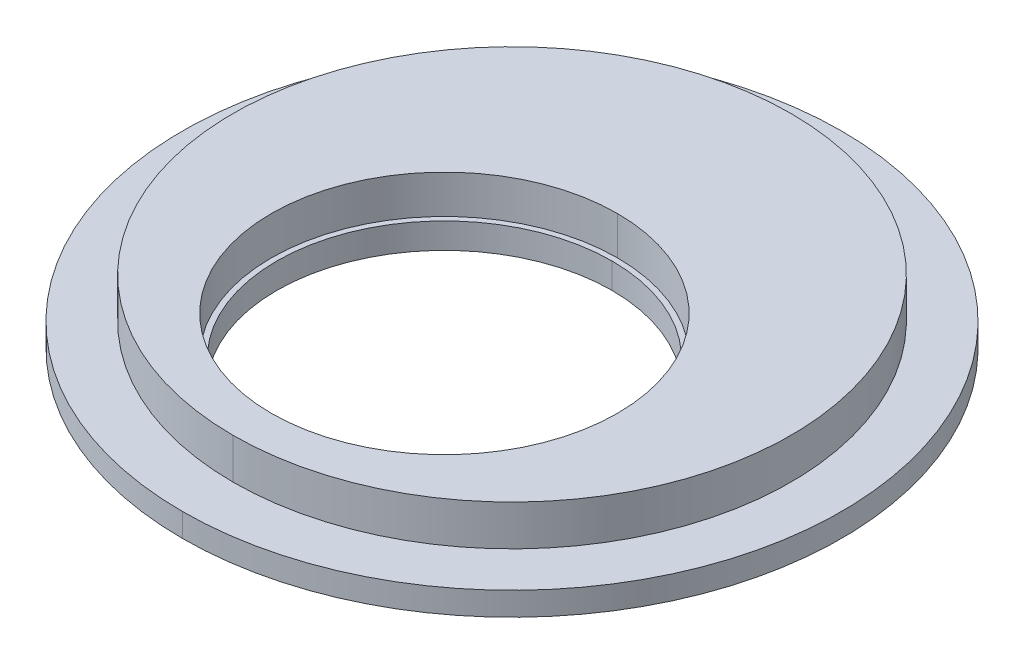
ISO-10303-21;
HEADER;
FILE_DESCRIPTION(('STEP AP214'),'2;1');
FILE_NAME('part.step','',(''),(''),'','','');
FILE_SCHEMA(('AUTOMOTIVE_DESIGN { 1 0 10303 214 1 1 1 1 }'));
ENDSEC;
DATA;
#1=APPLICATION_CONTEXT('core data for automotive mechanical design processes');
#2=APPLICATION_PROTOCOL_DEFINITION('international standard','automotive_design',2000,#1);
#3=PRODUCT_CONTEXT('',#1,'mechanical');
#4=PRODUCT('Part','Part','',(#3));
#5=PRODUCT_RELATED_PRODUCT_CATEGORY('part','',(#4));
#6=PRODUCT_DEFINITION_FORMATION('','',#4);
#7=PRODUCT_DEFINITION_CONTEXT('part definition',#1,'design');
#8=PRODUCT_DEFINITION('design','',#6,#7);
#9=PRODUCT_DEFINITION_SHAPE('','',#8);
#10=(LENGTH_UNIT() NAMED_UNIT(*) SI_UNIT(.MILLI.,.METRE.));
#11=(NAMED_UNIT(*) PLANE_ANGLE_UNIT() SI_UNIT($,.RADIAN.));
#12=(NAMED_UNIT(*) SI_UNIT($,.STERADIAN.) SOLID_ANGLE_UNIT());
#13=UNCERTAINTY_MEASURE_WITH_UNIT(LENGTH_MEASURE(1.E-05),#10,'distance_accuracy_value','');
#14=(GEOMETRIC_REPRESENTATION_CONTEXT(3) GLOBAL_UNCERTAINTY_ASSIGNED_CONTEXT((#13)) GLOBAL_UNIT_ASSIGNED_CONTEXT((#10,
#11,#12)) REPRESENTATION_CONTEXT('',''));
#15=CARTESIAN_POINT('',(0.,0.,0.));
#16=DIRECTION('',(0.,0.,1.));
#17=DIRECTION('',(1.,0.,0.));
#18=AXIS2_PLACEMENT_3D('',#15,#16,#17);
#19=CARTESIAN_POINT('',(0.,4.591800062,12.7));
#20=DIRECTION('',(0.,-1.,0.));
#21=DIRECTION('',(0.,0.,-1.));
#22=AXIS2_PLACEMENT_3D('',#19,#20,#21);
#23=CYLINDRICAL_SURFACE('',#22,31.496);
#24=DIRECTION('',(0.,-1.,0.));
#25=VECTOR('',#24,1.);
#26=CARTESIAN_POINT('',(0.,4.591800062,44.196));
#27=LINE('',#26,#25);
#28=CARTESIAN_POINT('',(0.,4.591800062,44.196));
#29=VERTEX_POINT('',#28);
#30=CARTESIAN_POINT('',(0.,-0.2032,44.196));
#31=VERTEX_POINT('',#30);
#32=EDGE_CURVE('P0_E71',#29,#31,#27,.T.);
#33=ORIENTED_EDGE('',*,*,#32,.F.);
#34=CARTESIAN_POINT('',(0.,4.591800062,12.7));
#35=DIRECTION('',(0.,-1.,0.));
#36=DIRECTION('',(0.,0.,-1.));
#37=AXIS2_PLACEMENT_3D('',#34,#35,#36);
#38=CIRCLE('',#37,31.496);
#39=CARTESIAN_POINT('',(0.,4.591800062,-18.796));
#40=VERTEX_POINT('',#39);
#41=EDGE_CURVE('P0_E26',#40,#29,#38,.T.);
#42=ORIENTED_EDGE('',*,*,#41,.F.);
#43=DIRECTION('',(0.,-1.,0.));
#44=VECTOR('',#43,1.);
#45=CARTESIAN_POINT('',(0.,4.591800062,-18.796));
#46=LINE('',#45,#44);
#47=CARTESIAN_POINT('',(0.,-0.2032,-18.796));
#48=VERTEX_POINT('',#47);
#49=EDGE_CURVE('P0_E74',#40,#48,#46,.T.);
#50=ORIENTED_EDGE('',*,*,#49,.T.);
#51=CARTESIAN_POINT('',(0.,-0.2032,12.7));
#52=DIRECTION('',(0.,-1.,0.));
#53=DIRECTION('',(0.,0.,-1.));
#54=AXIS2_PLACEMENT_3D('',#51,#52,#53);
#55=CIRCLE('',#54,31.496);
#56=EDGE_CURVE('P0_E10',#48,#31,#55,.T.);
#57=ORIENTED_EDGE('',*,*,#56,.T.);
#58=EDGE_LOOP('',(#33,#42,#50,#57));
#59=FACE_BOUND('',#58,.T.);
#60=ADVANCED_FACE('P0_F16',(#59),#23,.F.);
#61=CARTESIAN_POINT('',(0.,-0.2032,12.7));
#62=DIRECTION('',(0.,-1.,0.));
#63=DIRECTION('',(0.,0.,-1.));
#64=AXIS2_PLACEMENT_3D('',#61,#62,#63);
#65=PLANE('',#64);
#66=ORIENTED_EDGE('',*,*,#56,.F.);
#67=CARTESIAN_POINT('',(0.,-0.2032,12.7));
#68=DIRECTION('',(0.,-1.,0.));
#69=DIRECTION('',(0.,0.,-1.));
#70=AXIS2_PLACEMENT_3D('',#67,#68,#69);
#71=CIRCLE('',#70,31.496);
#72=EDGE_CURVE('P0_E76',#31,#48,#71,.T.);
#73=ORIENTED_EDGE('',*,*,#72,.F.);
#74=EDGE_LOOP('',(#66,#73));
#75=FACE_BOUND('',#74,.T.);
#76=CARTESIAN_POINT('',(0.,-0.2032,12.7));
#77=DIRECTION('',(0.,-1.,0.));
#78=DIRECTION('',(0.,0.,-1.));
#79=AXIS2_PLACEMENT_3D('',#76,#77,#78);
#80=CIRCLE('',#79,32.512);
#81=CARTESIAN_POINT('',(0.,-0.2032,-19.812));
#82=VERTEX_POINT('',#81);
#83=CARTESIAN_POINT('',(0.,-0.2032,45.212));
#84=VERTEX_POINT('',#83);
#85=EDGE_CURVE('P0_E95',#82,#84,#80,.T.);
#86=ORIENTED_EDGE('',*,*,#85,.T.);
#87=CARTESIAN_POINT('',(0.,-0.2032,12.7));
#88=DIRECTION('',(0.,-1.,0.));
#89=DIRECTION('',(0.,0.,-1.));
#90=AXIS2_PLACEMENT_3D('',#87,#88,#89);
#91=CIRCLE('',#90,32.512);
#92=EDGE_CURVE('P0_E40',#84,#82,#91,.T.);
#93=ORIENTED_EDGE('',*,*,#92,.T.);
#94=EDGE_LOOP('',(#86,#93));
#95=FACE_BOUND('',#94,.T.);
#96=ADVANCED_FACE('P0_F77',(#75,#95),#65,.T.);
#97=CARTESIAN_POINT('',(0.,4.591800062,12.7));
#98=DIRECTION('',(0.,-1.,0.));
#99=DIRECTION('',(0.,0.,-1.));
#100=AXIS2_PLACEMENT_3D('',#97,#98,#99);
#101=PLANE('',#100);
#102=ORIENTED_EDGE('',*,*,#41,.T.);
#103=CARTESIAN_POINT('',(0.,4.591800062,12.7));
#104=DIRECTION('',(0.,-1.,0.));
#105=DIRECTION('',(0.,0.,-1.));
#106=AXIS2_PLACEMENT_3D('',#103,#104,#105);
#107=CIRCLE('',#106,31.496);
#108=EDGE_CURVE('P0_E83',#29,#40,#107,.T.);
#109=ORIENTED_EDGE('',*,*,#108,.T.);
#110=EDGE_LOOP('',(#102,#109));
#111=FACE_BOUND('',#110,.T.);
#112=CARTESIAN_POINT('',(0.,4.591800062,12.7));
#113=DIRECTION('',(0.,-1.,0.));
#114=DIRECTION('',(0.,0.,-1.));
#115=AXIS2_PLACEMENT_3D('',#112,#113,#114);
#116=CIRCLE('',#115,32.512);
#117=CARTESIAN_POINT('',(0.,4.591800062,-19.812));
#118=VERTEX_POINT('',#117);
#119=CARTESIAN_POINT('',(0.,4.591800062,45.212));
#120=VERTEX_POINT('',#119);
#121=EDGE_CURVE('P0_E92',#118,#120,#116,.T.);
#122=ORIENTED_EDGE('',*,*,#121,.F.);
#123=CARTESIAN_POINT('',(0.,4.591800062,12.7));
#124=DIRECTION('',(0.,-1.,0.));
#125=DIRECTION('',(0.,0.,-1.));
#126=AXIS2_PLACEMENT_3D('',#123,#124,#125);
#127=CIRCLE('',#126,32.512);
#128=EDGE_CURVE('P0_E19',#120,#118,#127,.T.);
#129=ORIENTED_EDGE('',*,*,#128,.F.);
#130=EDGE_LOOP('',(#122,#129));
#131=FACE_BOUND('',#130,.T.);
#132=ADVANCED_FACE('P0_F124',(#111,#131),#101,.F.);
#133=CARTESIAN_POINT('',(0.,4.591800062,12.7));
#134=DIRECTION('',(0.,-1.,0.));
#135=DIRECTION('',(0.,0.,-1.));
#136=AXIS2_PLACEMENT_3D('',#133,#134,#135);
#137=CYLINDRICAL_SURFACE('',#136,32.512);
#138=DIRECTION('',(0.,-1.,0.));
#139=VECTOR('',#138,1.);
#140=CARTESIAN_POINT('',(0.,4.591800062,45.212));
#141=LINE('',#140,#139);
#142=EDGE_CURVE('P0_E99',#120,#84,#141,.T.);
#143=ORIENTED_EDGE('',*,*,#142,.F.);
#144=ORIENTED_EDGE('',*,*,#128,.T.);
#145=DIRECTION('',(0.,-1.,0.));
#146=VECTOR('',#145,1.);
#147=CARTESIAN_POINT('',(0.,4.591800062,-19.812));
#148=LINE('',#147,#146);
#149=EDGE_CURVE('P0_E98',#118,#82,#148,.T.);
#150=ORIENTED_EDGE('',*,*,#149,.T.);
#151=ORIENTED_EDGE('',*,*,#92,.F.);
#152=EDGE_LOOP('',(#143,#144,#150,#151));
#153=FACE_BOUND('',#152,.T.);
#154=ADVANCED_FACE('P0_F118',(#153),#137,.T.);
#155=CARTESIAN_POINT('',(0.,4.591800062,12.7));
#156=DIRECTION('',(0.,-1.,0.));
#157=DIRECTION('',(0.,0.,-1.));
#158=AXIS2_PLACEMENT_3D('',#155,#156,#157);
#159=CYLINDRICAL_SURFACE('',#158,32.512);
#160=ORIENTED_EDGE('',*,*,#121,.T.);
#161=ORIENTED_EDGE('',*,*,#142,.T.);
#162=ORIENTED_EDGE('',*,*,#85,.F.);
#163=ORIENTED_EDGE('',*,*,#149,.F.);
#164=EDGE_LOOP('',(#160,#161,#162,#163));
#165=FACE_BOUND('',#164,.T.);
#166=ADVANCED_FACE('P0_F114',(#165),#159,.T.);
#167=CARTESIAN_POINT('',(0.,4.591800062,12.7));
#168=DIRECTION('',(0.,-1.,0.));
#169=DIRECTION('',(0.,0.,-1.));
#170=AXIS2_PLACEMENT_3D('',#167,#168,#169);
#171=CYLINDRICAL_SURFACE('',#170,31.496);
#172=ORIENTED_EDGE('',*,*,#108,.F.);
#173=ORIENTED_EDGE('',*,*,#32,.T.);
#174=ORIENTED_EDGE('',*,*,#72,.T.);
#175=ORIENTED_EDGE('',*,*,#49,.F.);
#176=EDGE_LOOP('',(#172,#173,#174,#175));
#177=FACE_BOUND('',#176,.T.);
#178=ADVANCED_FACE('P0_F81',(#177),#171,.F.);
#179=CLOSED_SHELL('',(#60,#96,#132,#154,#166,#178));
#180=MANIFOLD_SOLID_BREP('P0_B1',#179);
#181=CARTESIAN_POINT('',(0.,11.811,12.7));
#182=DIRECTION('',(0.,-1.,0.));
#183=DIRECTION('',(0.,0.,-1.));
#184=AXIS2_PLACEMENT_3D('',#181,#182,#183);
#185=CYLINDRICAL_SURFACE('',#184,32.512);
#186=DIRECTION('',(0.,-1.,0.));
#187=VECTOR('',#186,1.);
#188=CARTESIAN_POINT('',(0.,11.811,45.212));
#189=LINE('',#188,#187);
#190=CARTESIAN_POINT('',(0.,11.811,45.212));
#191=VERTEX_POINT('',#190);
#192=CARTESIAN_POINT('',(0.,-0.2032,45.212));
#193=VERTEX_POINT('',#192);
#194=EDGE_CURVE('P1_E133',#191,#193,#189,.T.);
#195=ORIENTED_EDGE('',*,*,#194,.F.);
#196=CARTESIAN_POINT('',(0.,11.811,12.7));
#197=DIRECTION('',(0.,-1.,0.));
#198=DIRECTION('',(0.,0.,-1.));
#199=AXIS2_PLACEMENT_3D('',#196,#197,#198);
#200=CIRCLE('',#199,32.512);
#201=CARTESIAN_POINT('',(0.,11.811,-19.812));
#202=VERTEX_POINT('',#201);
#203=EDGE_CURVE('P1_E11',#202,#191,#200,.T.);
#204=ORIENTED_EDGE('',*,*,#203,.F.);
#205=DIRECTION('',(0.,1.,0.));
#206=VECTOR('',#205,1.);
#207=CARTESIAN_POINT('',(0.,11.811,-19.812));
#208=LINE('',#207,#206);
#209=CARTESIAN_POINT('',(0.,-0.2032,-19.812));
#210=VERTEX_POINT('',#209);
#211=EDGE_CURVE('P1_E132',#210,#202,#208,.T.);
#212=ORIENTED_EDGE('',*,*,#211,.F.);
#213=CARTESIAN_POINT('',(0.,-0.2032,12.7));
#214=DIRECTION('',(0.,-1.,0.));
#215=DIRECTION('',(0.,0.,-1.));
#216=AXIS2_PLACEMENT_3D('',#213,#214,#215);
#217=CIRCLE('',#216,32.512);
#218=EDGE_CURVE('P1_E40',#210,#193,#217,.T.);
#219=ORIENTED_EDGE('',*,*,#218,.T.);
#220=EDGE_LOOP('',(#195,#204,#212,#219));
#221=FACE_BOUND('',#220,.T.);
#222=ADVANCED_FACE('P1_F17',(#221),#185,.F.);
#223=CARTESIAN_POINT('',(0.,11.811,0.));
#224=DIRECTION('',(0.,-1.,0.));
#225=DIRECTION('',(0.,0.,-1.));
#226=AXIS2_PLACEMENT_3D('',#223,#224,#225);
#227=CYLINDRICAL_SURFACE('',#226,52.3875);
#228=DIRECTION('',(0.,-1.,0.));
#229=VECTOR('',#228,1.);
#230=CARTESIAN_POINT('',(0.,11.811,52.3875));
#231=LINE('',#230,#229);
#232=CARTESIAN_POINT('',(0.,11.811,52.3875));
#233=VERTEX_POINT('',#232);
#234=CARTESIAN_POINT('',(0.,4.191,52.3875));
#235=VERTEX_POINT('',#234);
#236=EDGE_CURVE('P1_E88',#233,#235,#231,.T.);
#237=ORIENTED_EDGE('',*,*,#236,.F.);
#238=CARTESIAN_POINT('',(0.,11.811,0.));
#239=DIRECTION('',(0.,1.,0.));
#240=DIRECTION('',(0.,0.,1.));
#241=AXIS2_PLACEMENT_3D('',#238,#239,#240);
#242=CIRCLE('',#241,52.3875);
#243=CARTESIAN_POINT('',(0.,11.811,-52.3875));
#244=VERTEX_POINT('',#243);
#245=EDGE_CURVE('P1_E27',#244,#233,#242,.T.);
#246=ORIENTED_EDGE('',*,*,#245,.F.);
#247=DIRECTION('',(0.,-1.,0.));
#248=VECTOR('',#247,1.);
#249=CARTESIAN_POINT('',(0.,11.811,-52.3875));
#250=LINE('',#249,#248);
#251=CARTESIAN_POINT('',(0.,4.191,-52.3875));
#252=VERTEX_POINT('',#251);
#253=EDGE_CURVE('P1_E91',#244,#252,#250,.T.);
#254=ORIENTED_EDGE('',*,*,#253,.T.);
#255=CARTESIAN_POINT('',(0.,4.191,0.));
#256=DIRECTION('',(0.,1.,0.));
#257=DIRECTION('',(0.,0.,1.));
#258=AXIS2_PLACEMENT_3D('',#255,#256,#257);
#259=CIRCLE('',#258,52.3875);
#260=EDGE_CURVE('P1_E21',#252,#235,#259,.T.);
#261=ORIENTED_EDGE('',*,*,#260,.T.);
#262=EDGE_LOOP('',(#237,#246,#254,#261));
#263=FACE_BOUND('',#262,.T.);
#264=ADVANCED_FACE('P1_F86',(#263),#227,.T.);
#265=CARTESIAN_POINT('',(0.,11.811,0.));
#266=DIRECTION('',(0.,1.,0.));
#267=DIRECTION('',(1.,0.,0.));
#268=AXIS2_PLACEMENT_3D('',#265,#266,#267);
#269=PLANE('',#268);
#270=ORIENTED_EDGE('',*,*,#203,.T.);
#271=CARTESIAN_POINT('',(0.,11.811,12.7));
#272=DIRECTION('',(0.,-1.,0.));
#273=DIRECTION('',(0.,0.,-1.));
#274=AXIS2_PLACEMENT_3D('',#271,#272,#273);
#275=CIRCLE('',#274,32.512);
#276=EDGE_CURVE('P1_E143',#191,#202,#275,.T.);
#277=ORIENTED_EDGE('',*,*,#276,.T.);
#278=EDGE_LOOP('',(#270,#277));
#279=FACE_BOUND('',#278,.T.);
#280=ORIENTED_EDGE('',*,*,#245,.T.);
#281=CARTESIAN_POINT('',(0.,11.811,0.));
#282=DIRECTION('',(0.,1.,0.));
#283=DIRECTION('',(0.,0.,1.));
#284=AXIS2_PLACEMENT_3D('',#281,#282,#283);
#285=CIRCLE('',#284,52.3875);
#286=EDGE_CURVE('P1_E102',#233,#244,#285,.T.);
#287=ORIENTED_EDGE('',*,*,#286,.T.);
#288=EDGE_LOOP('',(#280,#287));
#289=FACE_BOUND('',#288,.T.);
#290=ADVANCED_FACE('P1_F19',(#279,#289),#269,.T.);
#291=CARTESIAN_POINT('',(0.,4.191,0.));
#292=DIRECTION('',(0.,1.,0.));
#293=DIRECTION('',(1.,0.,0.));
#294=AXIS2_PLACEMENT_3D('',#291,#292,#293);
#295=PLANE('',#294);
#296=ORIENTED_EDGE('',*,*,#260,.F.);
#297=CARTESIAN_POINT('',(0.,4.191,0.));
#298=DIRECTION('',(0.,1.,0.));
#299=DIRECTION('',(0.,0.,1.));
#300=AXIS2_PLACEMENT_3D('',#297,#298,#299);
#301=CIRCLE('',#300,52.3875);
#302=EDGE_CURVE('P1_E94',#235,#252,#301,.T.);
#303=ORIENTED_EDGE('',*,*,#302,.F.);
#304=EDGE_LOOP('',(#296,#303));
#305=FACE_BOUND('',#304,.T.);
#306=CARTESIAN_POINT('',(0.,4.191,0.));
#307=DIRECTION('',(0.,1.,0.));
#308=DIRECTION('',(0.,0.,1.));
#309=AXIS2_PLACEMENT_3D('',#306,#307,#308);
#310=CIRCLE('',#309,61.9125);
#311=CARTESIAN_POINT('',(0.,4.191,61.9125));
#312=VERTEX_POINT('',#311);
#313=CARTESIAN_POINT('',(0.,4.191,-61.9125));
#314=VERTEX_POINT('',#313);
#315=EDGE_CURVE('P1_E127',#312,#314,#310,.T.);
#316=ORIENTED_EDGE('',*,*,#315,.T.);
#317=CARTESIAN_POINT('',(0.,4.191,0.));
#318=DIRECTION('',(0.,1.,0.));
#319=DIRECTION('',(0.,0.,1.));
#320=AXIS2_PLACEMENT_3D('',#317,#318,#319);
#321=CIRCLE('',#320,61.9125);
#322=EDGE_CURVE('P1_E123',#314,#312,#321,.T.);
#323=ORIENTED_EDGE('',*,*,#322,.T.);
#324=EDGE_LOOP('',(#316,#323));
#325=FACE_BOUND('',#324,.T.);
#326=ADVANCED_FACE('P1_F95',(#305,#325),#295,.T.);
#327=CARTESIAN_POINT('',(0.,-0.2032,0.));
#328=DIRECTION('',(0.,1.,0.));
#329=DIRECTION('',(1.,0.,0.));
#330=AXIS2_PLACEMENT_3D('',#327,#328,#329);
#331=PLANE('',#330);
#332=ORIENTED_EDGE('',*,*,#218,.F.);
#333=CARTESIAN_POINT('',(0.,-0.2032,12.7));
#334=DIRECTION('',(0.,-1.,0.));
#335=DIRECTION('',(0.,0.,-1.));
#336=AXIS2_PLACEMENT_3D('',#333,#334,#335);
#337=CIRCLE('',#336,32.512);
#338=EDGE_CURVE('P1_E128',#193,#210,#337,.T.);
#339=ORIENTED_EDGE('',*,*,#338,.F.);
#340=EDGE_LOOP('',(#332,#339));
#341=FACE_BOUND('',#340,.T.);
#342=CARTESIAN_POINT('',(0.,-0.2032,0.));
#343=DIRECTION('',(0.,1.,0.));
#344=DIRECTION('',(0.,0.,1.));
#345=AXIS2_PLACEMENT_3D('',#342,#343,#344);
#346=CIRCLE('',#345,61.9125);
#347=CARTESIAN_POINT('',(0.,-0.2032,61.9125));
#348=VERTEX_POINT('',#347);
#349=CARTESIAN_POINT('',(0.,-0.2032,-61.9125));
#350=VERTEX_POINT('',#349);
#351=EDGE_CURVE('P1_E116',#348,#350,#346,.T.);
#352=ORIENTED_EDGE('',*,*,#351,.F.);
#353=CARTESIAN_POINT('',(0.,-0.2032,0.));
#354=DIRECTION('',(0.,1.,0.));
#355=DIRECTION('',(0.,0.,1.));
#356=AXIS2_PLACEMENT_3D('',#353,#354,#355);
#357=CIRCLE('',#356,61.9125);
#358=EDGE_CURVE('P1_E134',#350,#348,#357,.T.);
#359=ORIENTED_EDGE('',*,*,#358,.F.);
#360=EDGE_LOOP('',(#352,#359));
#361=FACE_BOUND('',#360,.T.);
#362=ADVANCED_FACE('P1_F232',(#341,#361),#331,.F.);
#363=CARTESIAN_POINT('',(0.,-0.2032,0.));
#364=DIRECTION('',(0.,1.,0.));
#365=DIRECTION('',(0.,0.,1.));
#366=AXIS2_PLACEMENT_3D('',#363,#364,#365);
#367=CYLINDRICAL_SURFACE('',#366,61.9125);
#368=DIRECTION('',(0.,1.,0.));
#369=VECTOR('',#368,1.);
#370=CARTESIAN_POINT('',(0.,-0.2032,-61.9125));
#371=LINE('',#370,#369);
#372=EDGE_CURVE('P1_E120',#350,#314,#371,.T.);
#373=ORIENTED_EDGE('',*,*,#372,.F.);
#374=ORIENTED_EDGE('',*,*,#358,.T.);
#375=DIRECTION('',(0.,1.,0.));
#376=VECTOR('',#375,1.);
#377=CARTESIAN_POINT('',(0.,-0.2032,61.9125));
#378=LINE('',#377,#376);
#379=EDGE_CURVE('P1_E140',#348,#312,#378,.T.);
#380=ORIENTED_EDGE('',*,*,#379,.T.);
#381=ORIENTED_EDGE('',*,*,#322,.F.);
#382=EDGE_LOOP('',(#373,#374,#380,#381));
#383=FACE_BOUND('',#382,.T.);
#384=ADVANCED_FACE('P1_F241',(#383),#367,.T.);
#385=CARTESIAN_POINT('',(0.,11.811,12.7));
#386=DIRECTION('',(0.,-1.,0.));
#387=DIRECTION('',(0.,0.,-1.));
#388=AXIS2_PLACEMENT_3D('',#385,#386,#387);
#389=CYLINDRICAL_SURFACE('',#388,32.512);
#390=ORIENTED_EDGE('',*,*,#276,.F.);
#391=ORIENTED_EDGE('',*,*,#194,.T.);
#392=ORIENTED_EDGE('',*,*,#338,.T.);
#393=ORIENTED_EDGE('',*,*,#211,.T.);
#394=EDGE_LOOP('',(#390,#391,#392,#393));
#395=FACE_BOUND('',#394,.T.);
#396=ADVANCED_FACE('P1_F160',(#395),#389,.F.);
#397=CARTESIAN_POINT('',(0.,-0.2032,0.));
#398=DIRECTION('',(0.,1.,0.));
#399=DIRECTION('',(0.,0.,1.));
#400=AXIS2_PLACEMENT_3D('',#397,#398,#399);
#401=CYLINDRICAL_SURFACE('',#400,61.9125);
#402=ORIENTED_EDGE('',*,*,#351,.T.);
#403=ORIENTED_EDGE('',*,*,#372,.T.);
#404=ORIENTED_EDGE('',*,*,#315,.F.);
#405=ORIENTED_EDGE('',*,*,#379,.F.);
#406=EDGE_LOOP('',(#402,#403,#404,#405));
#407=FACE_BOUND('',#406,.T.);
#408=ADVANCED_FACE('P1_F240',(#407),#401,.T.);
#409=CARTESIAN_POINT('',(0.,11.811,0.));
#410=DIRECTION('',(0.,-1.,0.));
#411=DIRECTION('',(0.,0.,-1.));
#412=AXIS2_PLACEMENT_3D('',#409,#410,#411);
#413=CYLINDRICAL_SURFACE('',#412,52.3875);
#414=ORIENTED_EDGE('',*,*,#286,.F.);
#415=ORIENTED_EDGE('',*,*,#236,.T.);
#416=ORIENTED_EDGE('',*,*,#302,.T.);
#417=ORIENTED_EDGE('',*,*,#253,.F.);
#418=EDGE_LOOP('',(#414,#415,#416,#417));
#419=FACE_BOUND('',#418,.T.);
#420=ADVANCED_FACE('P1_F100',(#419),#413,.T.);
#421=CLOSED_SHELL('',(#222,#264,#290,#326,#362,#384,#396,#408,#420));
#422=MANIFOLD_SOLID_BREP('P1_B1',#421);
#423=ADVANCED_BREP_SHAPE_REPRESENTATION('',(#18,#180,#422),#14);
#424=SHAPE_DEFINITION_REPRESENTATION(#9,#423);
ENDSEC;
END-ISO-10303-21;
